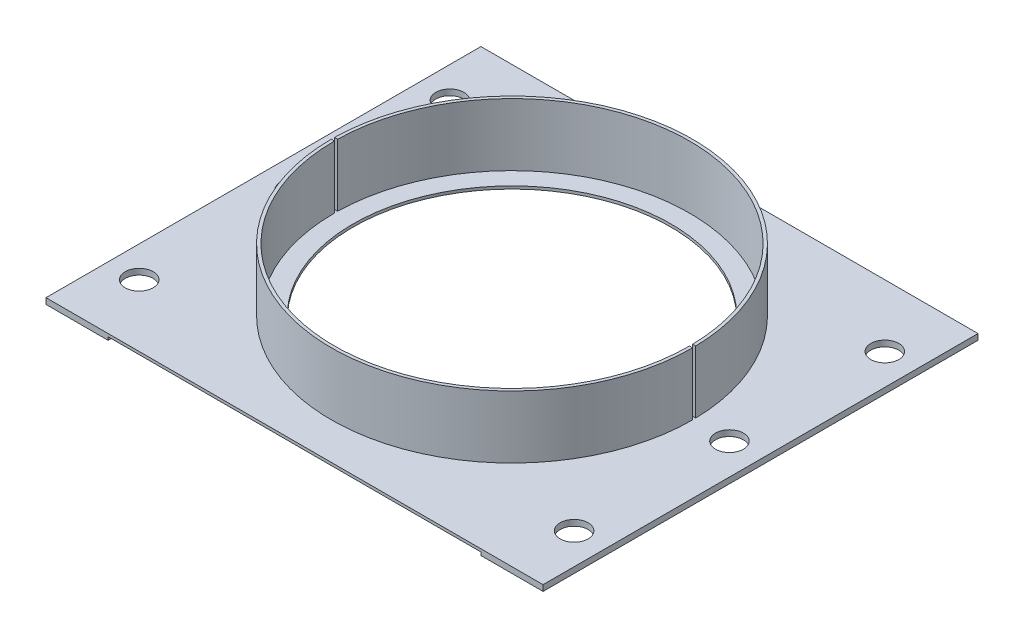
ISO-10303-21;
HEADER;
FILE_DESCRIPTION(('STEP AP214'),'2;1');
FILE_NAME('part.step','',(''),(''),'','','');
FILE_SCHEMA(('AUTOMOTIVE_DESIGN { 1 0 10303 214 1 1 1 1 }'));
ENDSEC;
DATA;
#1=APPLICATION_CONTEXT('core data for automotive mechanical design processes');
#2=APPLICATION_PROTOCOL_DEFINITION('international standard','automotive_design',2000,#1);
#3=PRODUCT_CONTEXT('',#1,'mechanical');
#4=PRODUCT('Part','Part','',(#3));
#5=PRODUCT_RELATED_PRODUCT_CATEGORY('part','',(#4));
#6=PRODUCT_DEFINITION_FORMATION('','',#4);
#7=PRODUCT_DEFINITION_CONTEXT('part definition',#1,'design');
#8=PRODUCT_DEFINITION('design','',#6,#7);
#9=PRODUCT_DEFINITION_SHAPE('','',#8);
#10=(LENGTH_UNIT() NAMED_UNIT(*) SI_UNIT(.MILLI.,.METRE.));
#11=(NAMED_UNIT(*) PLANE_ANGLE_UNIT() SI_UNIT($,.RADIAN.));
#12=(NAMED_UNIT(*) SI_UNIT($,.STERADIAN.) SOLID_ANGLE_UNIT());
#13=UNCERTAINTY_MEASURE_WITH_UNIT(LENGTH_MEASURE(1.E-05),#10,'distance_accuracy_value','');
#14=(GEOMETRIC_REPRESENTATION_CONTEXT(3) GLOBAL_UNCERTAINTY_ASSIGNED_CONTEXT((#13)) GLOBAL_UNIT_ASSIGNED_CONTEXT((#10,
#11,#12)) REPRESENTATION_CONTEXT('',''));
#15=CARTESIAN_POINT('',(0.,0.,0.));
#16=DIRECTION('',(0.,0.,1.));
#17=DIRECTION('',(1.,0.,0.));
#18=AXIS2_PLACEMENT_3D('',#15,#16,#17);
#19=CARTESIAN_POINT('',(0.,0.9,0.));
#20=DIRECTION('',(0.,1.,0.));
#21=DIRECTION('',(0.,0.,1.));
#22=AXIS2_PLACEMENT_3D('',#19,#20,#21);
#23=PLANE('',#22);
#24=DIRECTION('',(1.,0.,0.));
#25=VECTOR('',#24,1.);
#26=CARTESIAN_POINT('',(0.,0.9,-1.));
#27=LINE('',#26,#25);
#28=CARTESIAN_POINT('',(-58.1414009119148,0.900000000000008,-0.999999999999973));
#29=VERTEX_POINT('',#28);
#30=CARTESIAN_POINT('',(-57.14125042384,0.900000000000001,-0.999999999999957));
#31=VERTEX_POINT('',#30);
#32=EDGE_CURVE('E156',#29,#31,#27,.T.);
#33=ORIENTED_EDGE('',*,*,#32,.F.);
#34=CARTESIAN_POINT('',(0.,0.900000000000001,0.));
#35=DIRECTION('',(0.,1.,0.));
#36=DIRECTION('',(0.,0.,1.));
#37=AXIS2_PLACEMENT_3D('',#34,#35,#36);
#38=CIRCLE('',#37,58.15);
#39=CARTESIAN_POINT('',(58.1414009119148,0.900000000000001,-0.999999999999987));
#40=VERTEX_POINT('',#39);
#41=EDGE_CURVE('E176',#40,#29,#38,.T.);
#42=ORIENTED_EDGE('',*,*,#41,.F.);
#43=DIRECTION('',(-1.,0.,0.));
#44=VECTOR('',#43,1.);
#45=CARTESIAN_POINT('',(0.,0.9,-1.));
#46=LINE('',#45,#44);
#47=CARTESIAN_POINT('',(57.14125042384,0.9,-1.));
#48=VERTEX_POINT('',#47);
#49=EDGE_CURVE('E60',#40,#48,#46,.T.);
#50=ORIENTED_EDGE('',*,*,#49,.T.);
#51=CARTESIAN_POINT('',(0.,0.900000000000001,0.));
#52=DIRECTION('',(0.,1.,0.));
#53=DIRECTION('',(0.,0.,1.));
#54=AXIS2_PLACEMENT_3D('',#51,#52,#53);
#55=CIRCLE('',#54,57.15);
#56=EDGE_CURVE('E55',#48,#31,#55,.T.);
#57=ORIENTED_EDGE('',*,*,#56,.T.);
#58=EDGE_LOOP('',(#33,#42,#50,#57));
#59=FACE_BOUND('',#58,.T.);
#60=CARTESIAN_POINT('',(-70.,0.900000000000001,-50.));
#61=DIRECTION('',(0.,1.,0.));
#62=DIRECTION('',(0.,0.,1.));
#63=AXIS2_PLACEMENT_3D('',#60,#61,#62);
#64=CIRCLE('',#63,4.49999999999999);
#65=CARTESIAN_POINT('',(-70.,0.900000000000001,-45.5));
#66=VERTEX_POINT('',#65);
#67=EDGE_CURVE('E211',#66,#66,#64,.T.);
#68=ORIENTED_EDGE('',*,*,#67,.F.);
#69=EDGE_LOOP('',(#68));
#70=FACE_BOUND('',#69,.T.);
#71=CARTESIAN_POINT('',(-70.,0.900000000000001,0.));
#72=DIRECTION('',(0.,1.,0.));
#73=DIRECTION('',(0.,0.,1.));
#74=AXIS2_PLACEMENT_3D('',#71,#72,#73);
#75=CIRCLE('',#74,4.49999999999999);
#76=CARTESIAN_POINT('',(-70.,0.900000000000001,4.49999999999996));
#77=VERTEX_POINT('',#76);
#78=EDGE_CURVE('E230',#77,#77,#75,.T.);
#79=ORIENTED_EDGE('',*,*,#78,.F.);
#80=EDGE_LOOP('',(#79));
#81=FACE_BOUND('',#80,.T.);
#82=CARTESIAN_POINT('',(-70.,0.900000000000001,50.));
#83=DIRECTION('',(0.,1.,0.));
#84=DIRECTION('',(0.,0.,1.));
#85=AXIS2_PLACEMENT_3D('',#82,#83,#84);
#86=CIRCLE('',#85,4.49999999999999);
#87=CARTESIAN_POINT('',(-70.,0.900000000000001,54.5));
#88=VERTEX_POINT('',#87);
#89=EDGE_CURVE('E238',#88,#88,#86,.T.);
#90=ORIENTED_EDGE('',*,*,#89,.F.);
#91=EDGE_LOOP('',(#90));
#92=FACE_BOUND('',#91,.T.);
#93=CARTESIAN_POINT('',(70.,0.900000000000001,50.));
#94=DIRECTION('',(0.,1.,0.));
#95=DIRECTION('',(0.,0.,1.));
#96=AXIS2_PLACEMENT_3D('',#93,#94,#95);
#97=CIRCLE('',#96,4.49999999999999);
#98=CARTESIAN_POINT('',(70.,0.900000000000001,54.5));
#99=VERTEX_POINT('',#98);
#100=EDGE_CURVE('E246',#99,#99,#97,.T.);
#101=ORIENTED_EDGE('',*,*,#100,.F.);
#102=EDGE_LOOP('',(#101));
#103=FACE_BOUND('',#102,.T.);
#104=CARTESIAN_POINT('',(70.,0.900000000000001,0.));
#105=DIRECTION('',(0.,1.,0.));
#106=DIRECTION('',(0.,0.,1.));
#107=AXIS2_PLACEMENT_3D('',#104,#105,#106);
#108=CIRCLE('',#107,4.49999999999999);
#109=CARTESIAN_POINT('',(70.,0.900000000000001,4.49999999999996));
#110=VERTEX_POINT('',#109);
#111=EDGE_CURVE('E254',#110,#110,#108,.T.);
#112=ORIENTED_EDGE('',*,*,#111,.F.);
#113=EDGE_LOOP('',(#112));
#114=FACE_BOUND('',#113,.T.);
#115=CARTESIAN_POINT('',(70.,0.900000000000001,-50.));
#116=DIRECTION('',(0.,1.,0.));
#117=DIRECTION('',(0.,0.,1.));
#118=AXIS2_PLACEMENT_3D('',#115,#116,#117);
#119=CIRCLE('',#118,4.49999999999999);
#120=CARTESIAN_POINT('',(70.,0.900000000000001,-45.5));
#121=VERTEX_POINT('',#120);
#122=EDGE_CURVE('E262',#121,#121,#119,.T.);
#123=ORIENTED_EDGE('',*,*,#122,.F.);
#124=EDGE_LOOP('',(#123));
#125=FACE_BOUND('',#124,.T.);
#126=DIRECTION('',(0.,0.,-1.));
#127=VECTOR('',#126,1.);
#128=CARTESIAN_POINT('',(80.,0.9,-70.));
#129=LINE('',#128,#127);
#130=CARTESIAN_POINT('',(80.,0.9,70.));
#131=VERTEX_POINT('',#130);
#132=CARTESIAN_POINT('',(80.,0.9,-70.));
#133=VERTEX_POINT('',#132);
#134=EDGE_CURVE('E330',#131,#133,#129,.T.);
#135=ORIENTED_EDGE('',*,*,#134,.T.);
#136=DIRECTION('',(-1.,0.,0.));
#137=VECTOR('',#136,1.);
#138=CARTESIAN_POINT('',(-80.,0.9,-70.));
#139=LINE('',#138,#137);
#140=CARTESIAN_POINT('',(-80.,0.9,-70.));
#141=VERTEX_POINT('',#140);
#142=EDGE_CURVE('E334',#133,#141,#139,.T.);
#143=ORIENTED_EDGE('',*,*,#142,.T.);
#144=DIRECTION('',(0.,0.,1.));
#145=VECTOR('',#144,1.);
#146=CARTESIAN_POINT('',(-80.,0.9,-70.));
#147=LINE('',#146,#145);
#148=CARTESIAN_POINT('',(-80.,0.9,70.));
#149=VERTEX_POINT('',#148);
#150=EDGE_CURVE('E338',#141,#149,#147,.T.);
#151=ORIENTED_EDGE('',*,*,#150,.T.);
#152=DIRECTION('',(1.,0.,0.));
#153=VECTOR('',#152,1.);
#154=CARTESIAN_POINT('',(-80.,0.9,70.));
#155=LINE('',#154,#153);
#156=EDGE_CURVE('E341',#149,#131,#155,.T.);
#157=ORIENTED_EDGE('',*,*,#156,.T.);
#158=EDGE_LOOP('',(#135,#143,#151,#157));
#159=FACE_BOUND('',#158,.T.);
#160=CARTESIAN_POINT('',(0.,0.9,0.));
#161=DIRECTION('',(0.,1.,0.));
#162=DIRECTION('',(0.,0.,1.));
#163=AXIS2_PLACEMENT_3D('',#160,#161,#162);
#164=CIRCLE('',#163,51.15);
#165=CARTESIAN_POINT('',(0.,0.9,51.15));
#166=VERTEX_POINT('',#165);
#167=EDGE_CURVE('E322',#166,#166,#164,.T.);
#168=ORIENTED_EDGE('',*,*,#167,.F.);
#169=EDGE_LOOP('',(#168));
#170=FACE_BOUND('',#169,.T.);
#171=DIRECTION('',(1.,0.,0.));
#172=VECTOR('',#171,1.);
#173=CARTESIAN_POINT('',(0.,0.9,0.));
#174=LINE('',#173,#172);
#175=CARTESIAN_POINT('',(-58.15,0.900000000000001,0.));
#176=VERTEX_POINT('',#175);
#177=CARTESIAN_POINT('',(-57.15,0.9,0.));
#178=VERTEX_POINT('',#177);
#179=EDGE_CURVE('E48',#176,#178,#174,.T.);
#180=ORIENTED_EDGE('',*,*,#179,.T.);
#181=CARTESIAN_POINT('',(0.,0.900000000000001,0.));
#182=DIRECTION('',(0.,1.,0.));
#183=DIRECTION('',(0.,0.,1.));
#184=AXIS2_PLACEMENT_3D('',#181,#182,#183);
#185=CIRCLE('',#184,57.15);
#186=CARTESIAN_POINT('',(57.15,0.900000000000008,0.));
#187=VERTEX_POINT('',#186);
#188=EDGE_CURVE('E11',#178,#187,#185,.T.);
#189=ORIENTED_EDGE('',*,*,#188,.T.);
#190=DIRECTION('',(-1.,0.,0.));
#191=VECTOR('',#190,1.);
#192=CARTESIAN_POINT('',(0.,0.9,0.));
#193=LINE('',#192,#191);
#194=CARTESIAN_POINT('',(58.15,0.9,0.));
#195=VERTEX_POINT('',#194);
#196=EDGE_CURVE('E361',#195,#187,#193,.T.);
#197=ORIENTED_EDGE('',*,*,#196,.F.);
#198=CARTESIAN_POINT('',(0.,0.900000000000001,0.));
#199=DIRECTION('',(0.,1.,0.));
#200=DIRECTION('',(0.,0.,1.));
#201=AXIS2_PLACEMENT_3D('',#198,#199,#200);
#202=CIRCLE('',#201,58.15);
#203=EDGE_CURVE('E365',#176,#195,#202,.T.);
#204=ORIENTED_EDGE('',*,*,#203,.F.);
#205=EDGE_LOOP('',(#180,#189,#197,#204));
#206=FACE_BOUND('',#205,.T.);
#207=ADVANCED_FACE('F39',(#59,#70,#81,#92,#103,#114,#125,#159,#170,#206),#23,.T.);
#208=CARTESIAN_POINT('',(0.,0.,0.));
#209=DIRECTION('',(0.,1.,0.));
#210=DIRECTION('',(0.,0.,1.));
#211=AXIS2_PLACEMENT_3D('',#208,#209,#210);
#212=PLANE('',#211);
#213=DIRECTION('',(0.,0.,1.));
#214=VECTOR('',#213,1.);
#215=CARTESIAN_POINT('',(-60.,0.,-70.));
#216=LINE('',#215,#214);
#217=CARTESIAN_POINT('',(-60.,0.,-70.));
#218=VERTEX_POINT('',#217);
#219=CARTESIAN_POINT('',(-60.,0.,70.));
#220=VERTEX_POINT('',#219);
#221=EDGE_CURVE('E270',#218,#220,#216,.T.);
#222=ORIENTED_EDGE('',*,*,#221,.F.);
#223=DIRECTION('',(-1.,0.,0.));
#224=VECTOR('',#223,1.);
#225=CARTESIAN_POINT('',(-80.,0.,-70.));
#226=LINE('',#225,#224);
#227=CARTESIAN_POINT('',(60.,0.,-70.));
#228=VERTEX_POINT('',#227);
#229=EDGE_CURVE('E326',#228,#218,#226,.T.);
#230=ORIENTED_EDGE('',*,*,#229,.F.);
#231=DIRECTION('',(0.,0.,-1.));
#232=VECTOR('',#231,1.);
#233=CARTESIAN_POINT('',(60.,0.,-70.));
#234=LINE('',#233,#232);
#235=CARTESIAN_POINT('',(60.,0.,70.));
#236=VERTEX_POINT('',#235);
#237=EDGE_CURVE('E295',#236,#228,#234,.T.);
#238=ORIENTED_EDGE('',*,*,#237,.F.);
#239=DIRECTION('',(1.,0.,0.));
#240=VECTOR('',#239,1.);
#241=CARTESIAN_POINT('',(-80.,0.,70.));
#242=LINE('',#241,#240);
#243=EDGE_CURVE('E335',#220,#236,#242,.T.);
#244=ORIENTED_EDGE('',*,*,#243,.F.);
#245=EDGE_LOOP('',(#222,#230,#238,#244));
#246=FACE_BOUND('',#245,.T.);
#247=CARTESIAN_POINT('',(0.,0.,0.));
#248=DIRECTION('',(0.,1.,0.));
#249=DIRECTION('',(0.,0.,1.));
#250=AXIS2_PLACEMENT_3D('',#247,#248,#249);
#251=CIRCLE('',#250,51.15);
#252=CARTESIAN_POINT('',(0.,0.,51.15));
#253=VERTEX_POINT('',#252);
#254=EDGE_CURVE('E321',#253,#253,#251,.T.);
#255=ORIENTED_EDGE('',*,*,#254,.T.);
#256=EDGE_LOOP('',(#255));
#257=FACE_BOUND('',#256,.T.);
#258=ADVANCED_FACE('F396',(#246,#257),#212,.F.);
#259=CARTESIAN_POINT('',(80.,0.9,-70.));
#260=DIRECTION('',(-1.,0.,0.));
#261=DIRECTION('',(0.,0.,1.));
#262=AXIS2_PLACEMENT_3D('',#259,#260,#261);
#263=PLANE('',#262);
#264=DIRECTION('',(0.,-1.,0.));
#265=VECTOR('',#264,1.);
#266=CARTESIAN_POINT('',(80.,0.9,70.));
#267=LINE('',#266,#265);
#268=CARTESIAN_POINT('',(80.,-1.,70.));
#269=VERTEX_POINT('',#268);
#270=EDGE_CURVE('E344',#131,#269,#267,.T.);
#271=ORIENTED_EDGE('',*,*,#270,.T.);
#272=DIRECTION('',(0.,0.,1.));
#273=VECTOR('',#272,1.);
#274=CARTESIAN_POINT('',(80.,-1.,-70.));
#275=LINE('',#274,#273);
#276=CARTESIAN_POINT('',(80.,-1.,-70.));
#277=VERTEX_POINT('',#276);
#278=EDGE_CURVE('E296',#277,#269,#275,.T.);
#279=ORIENTED_EDGE('',*,*,#278,.F.);
#280=DIRECTION('',(0.,-1.,0.));
#281=VECTOR('',#280,1.);
#282=CARTESIAN_POINT('',(80.,0.9,-70.));
#283=LINE('',#282,#281);
#284=EDGE_CURVE('E358',#133,#277,#283,.T.);
#285=ORIENTED_EDGE('',*,*,#284,.F.);
#286=ORIENTED_EDGE('',*,*,#134,.F.);
#287=EDGE_LOOP('',(#271,#279,#285,#286));
#288=FACE_BOUND('',#287,.T.);
#289=ADVANCED_FACE('F41',(#288),#263,.F.);
#290=CARTESIAN_POINT('',(-80.,0.9,-70.));
#291=DIRECTION('',(0.,0.,1.));
#292=DIRECTION('',(1.,0.,0.));
#293=AXIS2_PLACEMENT_3D('',#290,#291,#292);
#294=PLANE('',#293);
#295=ORIENTED_EDGE('',*,*,#284,.T.);
#296=DIRECTION('',(1.,0.,0.));
#297=VECTOR('',#296,1.);
#298=CARTESIAN_POINT('',(80.,-1.,-70.));
#299=LINE('',#298,#297);
#300=CARTESIAN_POINT('',(60.,-1.,-70.));
#301=VERTEX_POINT('',#300);
#302=EDGE_CURVE('E306',#301,#277,#299,.T.);
#303=ORIENTED_EDGE('',*,*,#302,.F.);
#304=DIRECTION('',(0.,1.,0.));
#305=VECTOR('',#304,1.);
#306=CARTESIAN_POINT('',(60.,-1.,-70.));
#307=LINE('',#306,#305);
#308=EDGE_CURVE('E310',#301,#228,#307,.T.);
#309=ORIENTED_EDGE('',*,*,#308,.T.);
#310=ORIENTED_EDGE('',*,*,#229,.T.);
#311=DIRECTION('',(0.,1.,0.));
#312=VECTOR('',#311,1.);
#313=CARTESIAN_POINT('',(-60.,-1.,-70.));
#314=LINE('',#313,#312);
#315=CARTESIAN_POINT('',(-60.,-1.,-70.));
#316=VERTEX_POINT('',#315);
#317=EDGE_CURVE('E292',#316,#218,#314,.T.);
#318=ORIENTED_EDGE('',*,*,#317,.F.);
#319=DIRECTION('',(1.,0.,0.));
#320=VECTOR('',#319,1.);
#321=CARTESIAN_POINT('',(-80.,-1.,-70.));
#322=LINE('',#321,#320);
#323=CARTESIAN_POINT('',(-80.,-1.,-70.));
#324=VERTEX_POINT('',#323);
#325=EDGE_CURVE('E271',#324,#316,#322,.T.);
#326=ORIENTED_EDGE('',*,*,#325,.F.);
#327=DIRECTION('',(0.,-1.,0.));
#328=VECTOR('',#327,1.);
#329=CARTESIAN_POINT('',(-80.,0.9,-70.));
#330=LINE('',#329,#328);
#331=EDGE_CURVE('E355',#141,#324,#330,.T.);
#332=ORIENTED_EDGE('',*,*,#331,.F.);
#333=ORIENTED_EDGE('',*,*,#142,.F.);
#334=EDGE_LOOP('',(#295,#303,#309,#310,#318,#326,#332,#333));
#335=FACE_BOUND('',#334,.T.);
#336=ADVANCED_FACE('F414',(#335),#294,.F.);
#337=CARTESIAN_POINT('',(-80.,0.9,-70.));
#338=DIRECTION('',(1.,0.,0.));
#339=DIRECTION('',(0.,0.,-1.));
#340=AXIS2_PLACEMENT_3D('',#337,#338,#339);
#341=PLANE('',#340);
#342=ORIENTED_EDGE('',*,*,#331,.T.);
#343=DIRECTION('',(0.,0.,-1.));
#344=VECTOR('',#343,1.);
#345=CARTESIAN_POINT('',(-80.,-1.,-70.));
#346=LINE('',#345,#344);
#347=CARTESIAN_POINT('',(-80.,-1.,70.));
#348=VERTEX_POINT('',#347);
#349=EDGE_CURVE('E282',#348,#324,#346,.T.);
#350=ORIENTED_EDGE('',*,*,#349,.F.);
#351=DIRECTION('',(0.,-1.,0.));
#352=VECTOR('',#351,1.);
#353=CARTESIAN_POINT('',(-80.,0.9,70.));
#354=LINE('',#353,#352);
#355=EDGE_CURVE('E352',#149,#348,#354,.T.);
#356=ORIENTED_EDGE('',*,*,#355,.F.);
#357=ORIENTED_EDGE('',*,*,#150,.F.);
#358=EDGE_LOOP('',(#342,#350,#356,#357));
#359=FACE_BOUND('',#358,.T.);
#360=ADVANCED_FACE('F411',(#359),#341,.F.);
#361=CARTESIAN_POINT('',(-80.,0.9,70.));
#362=DIRECTION('',(0.,0.,-1.));
#363=DIRECTION('',(-1.,0.,0.));
#364=AXIS2_PLACEMENT_3D('',#361,#362,#363);
#365=PLANE('',#364);
#366=ORIENTED_EDGE('',*,*,#355,.T.);
#367=DIRECTION('',(-1.,0.,0.));
#368=VECTOR('',#367,1.);
#369=CARTESIAN_POINT('',(-80.,-1.,70.));
#370=LINE('',#369,#368);
#371=CARTESIAN_POINT('',(-60.,-1.,70.));
#372=VERTEX_POINT('',#371);
#373=EDGE_CURVE('E278',#372,#348,#370,.T.);
#374=ORIENTED_EDGE('',*,*,#373,.F.);
#375=DIRECTION('',(0.,1.,0.));
#376=VECTOR('',#375,1.);
#377=CARTESIAN_POINT('',(-60.,-1.,70.));
#378=LINE('',#377,#376);
#379=EDGE_CURVE('E286',#372,#220,#378,.T.);
#380=ORIENTED_EDGE('',*,*,#379,.T.);
#381=ORIENTED_EDGE('',*,*,#243,.T.);
#382=DIRECTION('',(0.,1.,0.));
#383=VECTOR('',#382,1.);
#384=CARTESIAN_POINT('',(60.,-1.,70.));
#385=LINE('',#384,#383);
#386=CARTESIAN_POINT('',(60.,-1.,70.));
#387=VERTEX_POINT('',#386);
#388=EDGE_CURVE('E317',#387,#236,#385,.T.);
#389=ORIENTED_EDGE('',*,*,#388,.F.);
#390=DIRECTION('',(-1.,0.,0.));
#391=VECTOR('',#390,1.);
#392=CARTESIAN_POINT('',(80.,-1.,70.));
#393=LINE('',#392,#391);
#394=EDGE_CURVE('E300',#269,#387,#393,.T.);
#395=ORIENTED_EDGE('',*,*,#394,.F.);
#396=ORIENTED_EDGE('',*,*,#270,.F.);
#397=ORIENTED_EDGE('',*,*,#156,.F.);
#398=EDGE_LOOP('',(#366,#374,#380,#381,#389,#395,#396,#397));
#399=FACE_BOUND('',#398,.T.);
#400=ADVANCED_FACE('F408',(#399),#365,.F.);
#401=CARTESIAN_POINT('',(0.,0.9,0.));
#402=DIRECTION('',(0.,-1.,0.));
#403=DIRECTION('',(0.,0.,-1.));
#404=AXIS2_PLACEMENT_3D('',#401,#402,#403);
#405=CYLINDRICAL_SURFACE('',#404,51.15);
#406=ORIENTED_EDGE('',*,*,#167,.T.);
#407=EDGE_LOOP('',(#406));
#408=FACE_BOUND('',#407,.T.);
#409=ORIENTED_EDGE('',*,*,#254,.F.);
#410=EDGE_LOOP('',(#409));
#411=FACE_BOUND('',#410,.T.);
#412=ADVANCED_FACE('F405',(#408,#411),#405,.F.);
#413=CARTESIAN_POINT('',(60.,-1.,-70.));
#414=DIRECTION('',(1.,0.,0.));
#415=DIRECTION('',(0.,0.,-1.));
#416=AXIS2_PLACEMENT_3D('',#413,#414,#415);
#417=PLANE('',#416);
#418=ORIENTED_EDGE('',*,*,#237,.T.);
#419=ORIENTED_EDGE('',*,*,#308,.F.);
#420=DIRECTION('',(0.,0.,-1.));
#421=VECTOR('',#420,1.);
#422=CARTESIAN_POINT('',(60.,-1.,-70.));
#423=LINE('',#422,#421);
#424=EDGE_CURVE('E303',#387,#301,#423,.T.);
#425=ORIENTED_EDGE('',*,*,#424,.F.);
#426=ORIENTED_EDGE('',*,*,#388,.T.);
#427=EDGE_LOOP('',(#418,#419,#425,#426));
#428=FACE_BOUND('',#427,.T.);
#429=ADVANCED_FACE('F438',(#428),#417,.F.);
#430=CARTESIAN_POINT('',(0.,-1.,0.));
#431=DIRECTION('',(0.,-1.,0.));
#432=DIRECTION('',(0.,0.,-1.));
#433=AXIS2_PLACEMENT_3D('',#430,#431,#432);
#434=PLANE('',#433);
#435=CARTESIAN_POINT('',(70.,-1.,50.));
#436=DIRECTION('',(0.,-1.,0.));
#437=DIRECTION('',(0.,0.,-1.));
#438=AXIS2_PLACEMENT_3D('',#435,#436,#437);
#439=CIRCLE('',#438,4.49999999999999);
#440=CARTESIAN_POINT('',(70.,-1.,45.5));
#441=VERTEX_POINT('',#440);
#442=EDGE_CURVE('E250',#441,#441,#439,.T.);
#443=ORIENTED_EDGE('',*,*,#442,.F.);
#444=EDGE_LOOP('',(#443));
#445=FACE_BOUND('',#444,.T.);
#446=CARTESIAN_POINT('',(70.,-1.,0.));
#447=DIRECTION('',(0.,-1.,0.));
#448=DIRECTION('',(0.,0.,-1.));
#449=AXIS2_PLACEMENT_3D('',#446,#447,#448);
#450=CIRCLE('',#449,4.49999999999999);
#451=CARTESIAN_POINT('',(70.,-1.,-4.50000000000002));
#452=VERTEX_POINT('',#451);
#453=EDGE_CURVE('E258',#452,#452,#450,.T.);
#454=ORIENTED_EDGE('',*,*,#453,.F.);
#455=EDGE_LOOP('',(#454));
#456=FACE_BOUND('',#455,.T.);
#457=CARTESIAN_POINT('',(70.,-1.,-50.));
#458=DIRECTION('',(0.,-1.,0.));
#459=DIRECTION('',(0.,0.,-1.));
#460=AXIS2_PLACEMENT_3D('',#457,#458,#459);
#461=CIRCLE('',#460,4.49999999999999);
#462=CARTESIAN_POINT('',(70.,-1.,-54.5));
#463=VERTEX_POINT('',#462);
#464=EDGE_CURVE('E266',#463,#463,#461,.T.);
#465=ORIENTED_EDGE('',*,*,#464,.F.);
#466=EDGE_LOOP('',(#465));
#467=FACE_BOUND('',#466,.T.);
#468=ORIENTED_EDGE('',*,*,#278,.T.);
#469=ORIENTED_EDGE('',*,*,#394,.T.);
#470=ORIENTED_EDGE('',*,*,#424,.T.);
#471=ORIENTED_EDGE('',*,*,#302,.T.);
#472=EDGE_LOOP('',(#468,#469,#470,#471));
#473=FACE_BOUND('',#472,.T.);
#474=ADVANCED_FACE('F428',(#445,#456,#467,#473),#434,.T.);
#475=CARTESIAN_POINT('',(-60.,-1.,-70.));
#476=DIRECTION('',(-1.,0.,0.));
#477=DIRECTION('',(0.,0.,1.));
#478=AXIS2_PLACEMENT_3D('',#475,#476,#477);
#479=PLANE('',#478);
#480=ORIENTED_EDGE('',*,*,#221,.T.);
#481=ORIENTED_EDGE('',*,*,#379,.F.);
#482=DIRECTION('',(0.,0.,1.));
#483=VECTOR('',#482,1.);
#484=CARTESIAN_POINT('',(-60.,-1.,-70.));
#485=LINE('',#484,#483);
#486=EDGE_CURVE('E275',#316,#372,#485,.T.);
#487=ORIENTED_EDGE('',*,*,#486,.F.);
#488=ORIENTED_EDGE('',*,*,#317,.T.);
#489=EDGE_LOOP('',(#480,#481,#487,#488));
#490=FACE_BOUND('',#489,.T.);
#491=ADVANCED_FACE('F445',(#490),#479,.F.);
#492=CARTESIAN_POINT('',(0.,-1.,0.));
#493=DIRECTION('',(0.,-1.,0.));
#494=DIRECTION('',(0.,0.,-1.));
#495=AXIS2_PLACEMENT_3D('',#492,#493,#494);
#496=PLANE('',#495);
#497=CARTESIAN_POINT('',(-70.,-1.,-50.));
#498=DIRECTION('',(0.,-1.,0.));
#499=DIRECTION('',(0.,0.,-1.));
#500=AXIS2_PLACEMENT_3D('',#497,#498,#499);
#501=CIRCLE('',#500,4.49999999999999);
#502=CARTESIAN_POINT('',(-70.,-1.,-54.5));
#503=VERTEX_POINT('',#502);
#504=EDGE_CURVE('E226',#503,#503,#501,.T.);
#505=ORIENTED_EDGE('',*,*,#504,.F.);
#506=EDGE_LOOP('',(#505));
#507=FACE_BOUND('',#506,.T.);
#508=CARTESIAN_POINT('',(-70.,-1.,0.));
#509=DIRECTION('',(0.,-1.,0.));
#510=DIRECTION('',(0.,0.,-1.));
#511=AXIS2_PLACEMENT_3D('',#508,#509,#510);
#512=CIRCLE('',#511,4.49999999999999);
#513=CARTESIAN_POINT('',(-70.,-1.,-4.50000000000002));
#514=VERTEX_POINT('',#513);
#515=EDGE_CURVE('E234',#514,#514,#512,.T.);
#516=ORIENTED_EDGE('',*,*,#515,.F.);
#517=EDGE_LOOP('',(#516));
#518=FACE_BOUND('',#517,.T.);
#519=CARTESIAN_POINT('',(-70.,-1.,50.));
#520=DIRECTION('',(0.,-1.,0.));
#521=DIRECTION('',(0.,0.,-1.));
#522=AXIS2_PLACEMENT_3D('',#519,#520,#521);
#523=CIRCLE('',#522,4.49999999999999);
#524=CARTESIAN_POINT('',(-70.,-1.,45.5));
#525=VERTEX_POINT('',#524);
#526=EDGE_CURVE('E242',#525,#525,#523,.T.);
#527=ORIENTED_EDGE('',*,*,#526,.F.);
#528=EDGE_LOOP('',(#527));
#529=FACE_BOUND('',#528,.T.);
#530=ORIENTED_EDGE('',*,*,#325,.T.);
#531=ORIENTED_EDGE('',*,*,#486,.T.);
#532=ORIENTED_EDGE('',*,*,#373,.T.);
#533=ORIENTED_EDGE('',*,*,#349,.T.);
#534=EDGE_LOOP('',(#530,#531,#532,#533));
#535=FACE_BOUND('',#534,.T.);
#536=ADVANCED_FACE('F448',(#507,#518,#529,#535),#496,.T.);
#537=CARTESIAN_POINT('',(70.,0.9,-50.));
#538=DIRECTION('',(0.,1.,0.));
#539=DIRECTION('',(0.,0.,1.));
#540=AXIS2_PLACEMENT_3D('',#537,#538,#539);
#541=CYLINDRICAL_SURFACE('',#540,4.49999999999999);
#542=ORIENTED_EDGE('',*,*,#464,.T.);
#543=EDGE_LOOP('',(#542));
#544=FACE_BOUND('',#543,.T.);
#545=ORIENTED_EDGE('',*,*,#122,.T.);
#546=EDGE_LOOP('',(#545));
#547=FACE_BOUND('',#546,.T.);
#548=ADVANCED_FACE('F472',(#544,#547),#541,.F.);
#549=CARTESIAN_POINT('',(70.,0.9,0.));
#550=DIRECTION('',(0.,1.,0.));
#551=DIRECTION('',(0.,0.,1.));
#552=AXIS2_PLACEMENT_3D('',#549,#550,#551);
#553=CYLINDRICAL_SURFACE('',#552,4.49999999999999);
#554=ORIENTED_EDGE('',*,*,#453,.T.);
#555=EDGE_LOOP('',(#554));
#556=FACE_BOUND('',#555,.T.);
#557=ORIENTED_EDGE('',*,*,#111,.T.);
#558=EDGE_LOOP('',(#557));
#559=FACE_BOUND('',#558,.T.);
#560=ADVANCED_FACE('F476',(#556,#559),#553,.F.);
#561=CARTESIAN_POINT('',(70.,0.9,50.));
#562=DIRECTION('',(0.,1.,0.));
#563=DIRECTION('',(0.,0.,1.));
#564=AXIS2_PLACEMENT_3D('',#561,#562,#563);
#565=CYLINDRICAL_SURFACE('',#564,4.49999999999999);
#566=ORIENTED_EDGE('',*,*,#442,.T.);
#567=EDGE_LOOP('',(#566));
#568=FACE_BOUND('',#567,.T.);
#569=ORIENTED_EDGE('',*,*,#100,.T.);
#570=EDGE_LOOP('',(#569));
#571=FACE_BOUND('',#570,.T.);
#572=ADVANCED_FACE('F480',(#568,#571),#565,.F.);
#573=CARTESIAN_POINT('',(-70.,0.9,50.));
#574=DIRECTION('',(0.,1.,0.));
#575=DIRECTION('',(0.,0.,1.));
#576=AXIS2_PLACEMENT_3D('',#573,#574,#575);
#577=CYLINDRICAL_SURFACE('',#576,4.49999999999999);
#578=ORIENTED_EDGE('',*,*,#526,.T.);
#579=EDGE_LOOP('',(#578));
#580=FACE_BOUND('',#579,.T.);
#581=ORIENTED_EDGE('',*,*,#89,.T.);
#582=EDGE_LOOP('',(#581));
#583=FACE_BOUND('',#582,.T.);
#584=ADVANCED_FACE('F484',(#580,#583),#577,.F.);
#585=CARTESIAN_POINT('',(-70.,0.9,0.));
#586=DIRECTION('',(0.,1.,0.));
#587=DIRECTION('',(0.,0.,1.));
#588=AXIS2_PLACEMENT_3D('',#585,#586,#587);
#589=CYLINDRICAL_SURFACE('',#588,4.49999999999999);
#590=ORIENTED_EDGE('',*,*,#515,.T.);
#591=EDGE_LOOP('',(#590));
#592=FACE_BOUND('',#591,.T.);
#593=ORIENTED_EDGE('',*,*,#78,.T.);
#594=EDGE_LOOP('',(#593));
#595=FACE_BOUND('',#594,.T.);
#596=ADVANCED_FACE('F488',(#592,#595),#589,.F.);
#597=CARTESIAN_POINT('',(-70.,0.9,-50.));
#598=DIRECTION('',(0.,1.,0.));
#599=DIRECTION('',(0.,0.,1.));
#600=AXIS2_PLACEMENT_3D('',#597,#598,#599);
#601=CYLINDRICAL_SURFACE('',#600,4.49999999999999);
#602=ORIENTED_EDGE('',*,*,#504,.T.);
#603=EDGE_LOOP('',(#602));
#604=FACE_BOUND('',#603,.T.);
#605=ORIENTED_EDGE('',*,*,#67,.T.);
#606=EDGE_LOOP('',(#605));
#607=FACE_BOUND('',#606,.T.);
#608=ADVANCED_FACE('F492',(#604,#607),#601,.F.);
#609=CARTESIAN_POINT('',(0.,21.,0.));
#610=DIRECTION('',(0.,-1.,0.));
#611=DIRECTION('',(0.,0.,-1.));
#612=AXIS2_PLACEMENT_3D('',#609,#610,#611);
#613=CYLINDRICAL_SURFACE('',#612,57.15);
#614=ORIENTED_EDGE('',*,*,#188,.F.);
#615=DIRECTION('',(0.,-1.,0.));
#616=VECTOR('',#615,1.);
#617=CARTESIAN_POINT('',(-57.15,21.,0.));
#618=LINE('',#617,#616);
#619=CARTESIAN_POINT('',(-57.15,21.,0.));
#620=VERTEX_POINT('',#619);
#621=EDGE_CURVE('E207',#620,#178,#618,.T.);
#622=ORIENTED_EDGE('',*,*,#621,.F.);
#623=CARTESIAN_POINT('',(0.,21.,0.));
#624=DIRECTION('',(0.,-1.,0.));
#625=DIRECTION('',(0.,0.,-1.));
#626=AXIS2_PLACEMENT_3D('',#623,#624,#625);
#627=CIRCLE('',#626,57.15);
#628=CARTESIAN_POINT('',(57.15,21.,0.));
#629=VERTEX_POINT('',#628);
#630=EDGE_CURVE('E191',#629,#620,#627,.T.);
#631=ORIENTED_EDGE('',*,*,#630,.F.);
#632=DIRECTION('',(0.,-1.,0.));
#633=VECTOR('',#632,1.);
#634=CARTESIAN_POINT('',(57.15,21.,0.));
#635=LINE('',#634,#633);
#636=EDGE_CURVE('E206',#629,#187,#635,.T.);
#637=ORIENTED_EDGE('',*,*,#636,.T.);
#638=EDGE_LOOP('',(#614,#622,#631,#637));
#639=FACE_BOUND('',#638,.T.);
#640=ADVANCED_FACE('F376',(#639),#613,.F.);
#641=CARTESIAN_POINT('',(0.,21.,0.));
#642=DIRECTION('',(0.,0.,1.));
#643=DIRECTION('',(1.,0.,0.));
#644=AXIS2_PLACEMENT_3D('',#641,#642,#643);
#645=PLANE('',#644);
#646=ORIENTED_EDGE('',*,*,#179,.F.);
#647=DIRECTION('',(0.,-1.,0.));
#648=VECTOR('',#647,1.);
#649=CARTESIAN_POINT('',(-58.15,21.,0.));
#650=LINE('',#649,#648);
#651=CARTESIAN_POINT('',(-58.15,21.,0.));
#652=VERTEX_POINT('',#651);
#653=EDGE_CURVE('E212',#652,#176,#650,.T.);
#654=ORIENTED_EDGE('',*,*,#653,.F.);
#655=DIRECTION('',(-1.,0.,0.));
#656=VECTOR('',#655,1.);
#657=CARTESIAN_POINT('',(0.,21.,0.));
#658=LINE('',#657,#656);
#659=EDGE_CURVE('E203',#620,#652,#658,.T.);
#660=ORIENTED_EDGE('',*,*,#659,.F.);
#661=ORIENTED_EDGE('',*,*,#621,.T.);
#662=EDGE_LOOP('',(#646,#654,#660,#661));
#663=FACE_BOUND('',#662,.T.);
#664=ADVANCED_FACE('F378',(#663),#645,.F.);
#665=CARTESIAN_POINT('',(0.,21.,0.));
#666=DIRECTION('',(0.,-1.,0.));
#667=DIRECTION('',(0.,0.,-1.));
#668=AXIS2_PLACEMENT_3D('',#665,#666,#667);
#669=CYLINDRICAL_SURFACE('',#668,58.15);
#670=ORIENTED_EDGE('',*,*,#653,.T.);
#671=ORIENTED_EDGE('',*,*,#203,.T.);
#672=DIRECTION('',(0.,-1.,0.));
#673=VECTOR('',#672,1.);
#674=CARTESIAN_POINT('',(58.15,21.,0.));
#675=LINE('',#674,#673);
#676=CARTESIAN_POINT('',(58.15,21.,0.));
#677=VERTEX_POINT('',#676);
#678=EDGE_CURVE('E216',#677,#195,#675,.T.);
#679=ORIENTED_EDGE('',*,*,#678,.F.);
#680=CARTESIAN_POINT('',(0.,21.,0.));
#681=DIRECTION('',(0.,-1.,0.));
#682=DIRECTION('',(0.,0.,-1.));
#683=AXIS2_PLACEMENT_3D('',#680,#681,#682);
#684=CIRCLE('',#683,58.15);
#685=EDGE_CURVE('E199',#677,#652,#684,.T.);
#686=ORIENTED_EDGE('',*,*,#685,.T.);
#687=EDGE_LOOP('',(#670,#671,#679,#686));
#688=FACE_BOUND('',#687,.T.);
#689=ADVANCED_FACE('F386',(#688),#669,.T.);
#690=CARTESIAN_POINT('',(0.,21.,0.));
#691=DIRECTION('',(0.,0.,-1.));
#692=DIRECTION('',(-1.,0.,0.));
#693=AXIS2_PLACEMENT_3D('',#690,#691,#692);
#694=PLANE('',#693);
#695=ORIENTED_EDGE('',*,*,#678,.T.);
#696=ORIENTED_EDGE('',*,*,#196,.T.);
#697=ORIENTED_EDGE('',*,*,#636,.F.);
#698=DIRECTION('',(1.,0.,0.));
#699=VECTOR('',#698,1.);
#700=CARTESIAN_POINT('',(0.,21.,0.));
#701=LINE('',#700,#699);
#702=EDGE_CURVE('E195',#629,#677,#701,.T.);
#703=ORIENTED_EDGE('',*,*,#702,.T.);
#704=EDGE_LOOP('',(#695,#696,#697,#703));
#705=FACE_BOUND('',#704,.T.);
#706=ADVANCED_FACE('F384',(#705),#694,.T.);
#707=CARTESIAN_POINT('',(0.,21.,0.));
#708=DIRECTION('',(0.,-1.,0.));
#709=DIRECTION('',(0.,0.,-1.));
#710=AXIS2_PLACEMENT_3D('',#707,#708,#709);
#711=PLANE('',#710);
#712=ORIENTED_EDGE('',*,*,#630,.T.);
#713=ORIENTED_EDGE('',*,*,#659,.T.);
#714=ORIENTED_EDGE('',*,*,#685,.F.);
#715=ORIENTED_EDGE('',*,*,#702,.F.);
#716=EDGE_LOOP('',(#712,#713,#714,#715));
#717=FACE_BOUND('',#716,.T.);
#718=ADVANCED_FACE('F382',(#717),#711,.F.);
#719=CARTESIAN_POINT('',(-57.14125042384,21.,-1.));
#720=DIRECTION('',(0.,0.,1.));
#721=DIRECTION('',(1.,0.,0.));
#722=AXIS2_PLACEMENT_3D('',#719,#720,#721);
#723=PLANE('',#722);
#724=DIRECTION('',(0.,-1.,0.));
#725=VECTOR('',#724,1.);
#726=CARTESIAN_POINT('',(-58.1414009119148,21.,-0.999999999999973));
#727=LINE('',#726,#725);
#728=CARTESIAN_POINT('',(-58.1414009119148,21.,-0.999999999999973));
#729=VERTEX_POINT('',#728);
#730=EDGE_CURVE('E169',#729,#29,#727,.T.);
#731=ORIENTED_EDGE('',*,*,#730,.T.);
#732=ORIENTED_EDGE('',*,*,#32,.T.);
#733=DIRECTION('',(0.,-1.,0.));
#734=VECTOR('',#733,1.);
#735=CARTESIAN_POINT('',(-57.14125042384,21.,-0.999999999999957));
#736=LINE('',#735,#734);
#737=CARTESIAN_POINT('',(-57.14125042384,21.,-0.999999999999957));
#738=VERTEX_POINT('',#737);
#739=EDGE_CURVE('E150',#738,#31,#736,.T.);
#740=ORIENTED_EDGE('',*,*,#739,.F.);
#741=DIRECTION('',(-1.,0.,0.));
#742=VECTOR('',#741,1.);
#743=CARTESIAN_POINT('',(-57.14125042384,21.,-1.));
#744=LINE('',#743,#742);
#745=EDGE_CURVE('E155',#738,#729,#744,.T.);
#746=ORIENTED_EDGE('',*,*,#745,.T.);
#747=EDGE_LOOP('',(#731,#732,#740,#746));
#748=FACE_BOUND('',#747,.T.);
#749=ADVANCED_FACE('F153',(#748),#723,.T.);
#750=CARTESIAN_POINT('',(0.,21.,0.));
#751=DIRECTION('',(0.,-1.,0.));
#752=DIRECTION('',(0.,0.,-1.));
#753=AXIS2_PLACEMENT_3D('',#750,#751,#752);
#754=CYLINDRICAL_SURFACE('',#753,57.15);
#755=ORIENTED_EDGE('',*,*,#56,.F.);
#756=DIRECTION('',(0.,-1.,0.));
#757=VECTOR('',#756,1.);
#758=CARTESIAN_POINT('',(57.14125042384,21.,-1.));
#759=LINE('',#758,#757);
#760=CARTESIAN_POINT('',(57.14125042384,21.,-1.));
#761=VERTEX_POINT('',#760);
#762=EDGE_CURVE('E159',#761,#48,#759,.T.);
#763=ORIENTED_EDGE('',*,*,#762,.F.);
#764=CARTESIAN_POINT('',(0.,21.,0.));
#765=DIRECTION('',(0.,-1.,0.));
#766=DIRECTION('',(0.,0.,-1.));
#767=AXIS2_PLACEMENT_3D('',#764,#765,#766);
#768=CIRCLE('',#767,57.15);
#769=EDGE_CURVE('E162',#738,#761,#768,.T.);
#770=ORIENTED_EDGE('',*,*,#769,.F.);
#771=ORIENTED_EDGE('',*,*,#739,.T.);
#772=EDGE_LOOP('',(#755,#763,#770,#771));
#773=FACE_BOUND('',#772,.T.);
#774=ADVANCED_FACE('F163',(#773),#754,.F.);
#775=CARTESIAN_POINT('',(57.14125042384,21.,-1.));
#776=DIRECTION('',(0.,0.,-1.));
#777=DIRECTION('',(-1.,0.,0.));
#778=AXIS2_PLACEMENT_3D('',#775,#776,#777);
#779=PLANE('',#778);
#780=ORIENTED_EDGE('',*,*,#49,.F.);
#781=DIRECTION('',(0.,-1.,0.));
#782=VECTOR('',#781,1.);
#783=CARTESIAN_POINT('',(58.1414009119148,21.,-0.999999999999987));
#784=LINE('',#783,#782);
#785=CARTESIAN_POINT('',(58.1414009119148,21.,-0.999999999999987));
#786=VERTEX_POINT('',#785);
#787=EDGE_CURVE('E576',#786,#40,#784,.T.);
#788=ORIENTED_EDGE('',*,*,#787,.F.);
#789=DIRECTION('',(1.,0.,0.));
#790=VECTOR('',#789,1.);
#791=CARTESIAN_POINT('',(57.14125042384,21.,-1.));
#792=LINE('',#791,#790);
#793=EDGE_CURVE('E168',#761,#786,#792,.T.);
#794=ORIENTED_EDGE('',*,*,#793,.F.);
#795=ORIENTED_EDGE('',*,*,#762,.T.);
#796=EDGE_LOOP('',(#780,#788,#794,#795));
#797=FACE_BOUND('',#796,.T.);
#798=ADVANCED_FACE('F543',(#797),#779,.F.);
#799=CARTESIAN_POINT('',(0.,21.,0.));
#800=DIRECTION('',(0.,-1.,0.));
#801=DIRECTION('',(0.,0.,-1.));
#802=AXIS2_PLACEMENT_3D('',#799,#800,#801);
#803=CYLINDRICAL_SURFACE('',#802,58.15);
#804=ORIENTED_EDGE('',*,*,#787,.T.);
#805=ORIENTED_EDGE('',*,*,#41,.T.);
#806=ORIENTED_EDGE('',*,*,#730,.F.);
#807=CARTESIAN_POINT('',(0.,21.,0.));
#808=DIRECTION('',(0.,-1.,0.));
#809=DIRECTION('',(0.,0.,-1.));
#810=AXIS2_PLACEMENT_3D('',#807,#808,#809);
#811=CIRCLE('',#810,58.15);
#812=EDGE_CURVE('E174',#729,#786,#811,.T.);
#813=ORIENTED_EDGE('',*,*,#812,.T.);
#814=EDGE_LOOP('',(#804,#805,#806,#813));
#815=FACE_BOUND('',#814,.T.);
#816=ADVANCED_FACE('F552',(#815),#803,.T.);
#817=CARTESIAN_POINT('',(0.,21.,0.));
#818=DIRECTION('',(0.,-1.,0.));
#819=DIRECTION('',(0.,0.,-1.));
#820=AXIS2_PLACEMENT_3D('',#817,#818,#819);
#821=PLANE('',#820);
#822=ORIENTED_EDGE('',*,*,#745,.F.);
#823=ORIENTED_EDGE('',*,*,#769,.T.);
#824=ORIENTED_EDGE('',*,*,#793,.T.);
#825=ORIENTED_EDGE('',*,*,#812,.F.);
#826=EDGE_LOOP('',(#822,#823,#824,#825));
#827=FACE_BOUND('',#826,.T.);
#828=ADVANCED_FACE('F172',(#827),#821,.F.);
#829=CLOSED_SHELL('',(#207,#258,#289,#336,#360,#400,#412,#429,#474,#491,#536,#548,#560,#572,
#584,#596,#608,#640,#664,#689,#706,#718,#749,#774,#798,#816,#828));
#830=MANIFOLD_SOLID_BREP('B2',#829);
#831=ADVANCED_BREP_SHAPE_REPRESENTATION('',(#18,#830),#14);
#832=SHAPE_DEFINITION_REPRESENTATION(#9,#831);
ENDSEC;
END-ISO-10303-21;
